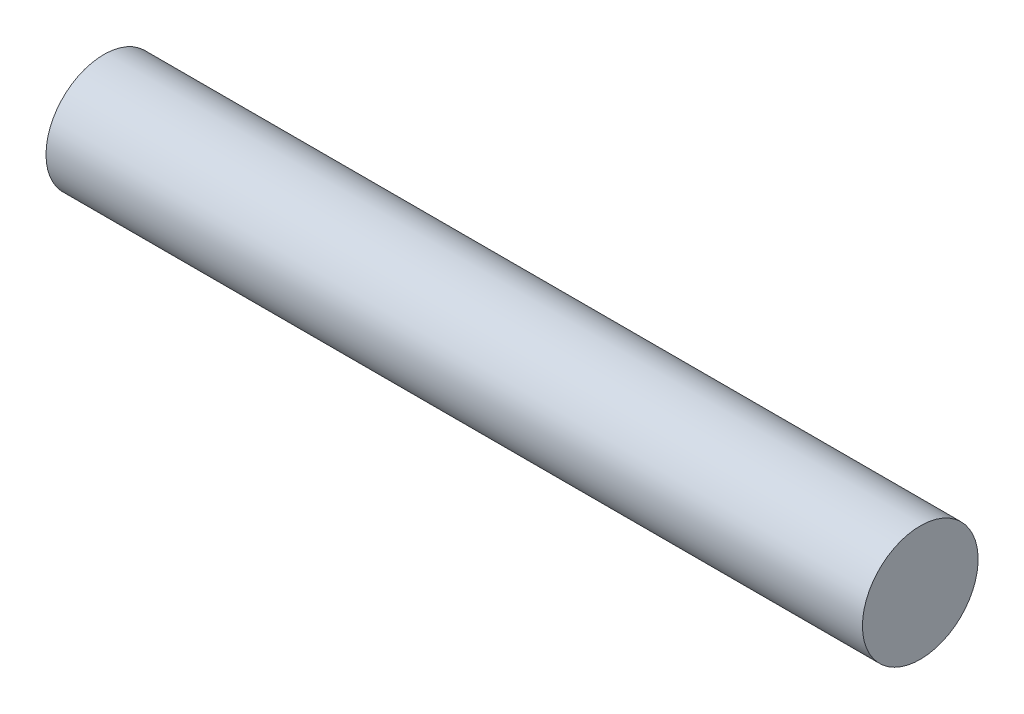
ISO-10303-21;
HEADER;
FILE_DESCRIPTION(('STEP AP214'),'2;1');
FILE_NAME('part.step','',(''),(''),'','','');
FILE_SCHEMA(('AUTOMOTIVE_DESIGN { 1 0 10303 214 1 1 1 1 }'));
ENDSEC;
DATA;
#1=APPLICATION_CONTEXT('core data for automotive mechanical design processes');
#2=APPLICATION_PROTOCOL_DEFINITION('international standard','automotive_design',2000,#1);
#3=PRODUCT_CONTEXT('',#1,'mechanical');
#4=PRODUCT('Part','Part','',(#3));
#5=PRODUCT_RELATED_PRODUCT_CATEGORY('part','',(#4));
#6=PRODUCT_DEFINITION_FORMATION('','',#4);
#7=PRODUCT_DEFINITION_CONTEXT('part definition',#1,'design');
#8=PRODUCT_DEFINITION('design','',#6,#7);
#9=PRODUCT_DEFINITION_SHAPE('','',#8);
#10=(LENGTH_UNIT() NAMED_UNIT(*) SI_UNIT(.MILLI.,.METRE.));
#11=(NAMED_UNIT(*) PLANE_ANGLE_UNIT() SI_UNIT($,.RADIAN.));
#12=(NAMED_UNIT(*) SI_UNIT($,.STERADIAN.) SOLID_ANGLE_UNIT());
#13=UNCERTAINTY_MEASURE_WITH_UNIT(LENGTH_MEASURE(1.E-05),#10,'distance_accuracy_value','');
#14=(GEOMETRIC_REPRESENTATION_CONTEXT(3) GLOBAL_UNCERTAINTY_ASSIGNED_CONTEXT((#13)) GLOBAL_UNIT_ASSIGNED_CONTEXT((#10,
#11,#12)) REPRESENTATION_CONTEXT('',''));
#15=CARTESIAN_POINT('',(0.,0.,0.));
#16=DIRECTION('',(0.,0.,1.));
#17=DIRECTION('',(1.,0.,0.));
#18=AXIS2_PLACEMENT_3D('',#15,#16,#17);
#19=CARTESIAN_POINT('',(0.,0.,-63.7499999999998));
#20=DIRECTION('',(-1.,0.,0.));
#21=DIRECTION('',(0.,0.,1.));
#22=AXIS2_PLACEMENT_3D('',#19,#20,#21);
#23=PLANE('',#22);
#24=CARTESIAN_POINT('',(0.,0.,-63.7499999999998));
#25=DIRECTION('',(-1.,0.,0.));
#26=DIRECTION('',(0.,0.,1.));
#27=AXIS2_PLACEMENT_3D('',#24,#25,#26);
#28=CIRCLE('',#27,63.7499999999998);
#29=CARTESIAN_POINT('',(0.,0.,0.));
#30=VERTEX_POINT('',#29);
#31=EDGE_CURVE('E10',#30,#30,#28,.T.);
#32=ORIENTED_EDGE('',*,*,#31,.T.);
#33=EDGE_LOOP('',(#32));
#34=FACE_BOUND('',#33,.T.);
#35=ADVANCED_FACE('F35',(#34),#23,.T.);
#36=CARTESIAN_POINT('',(900.,0.,-63.7499999999999));
#37=DIRECTION('',(-1.,0.,0.));
#38=DIRECTION('',(0.,0.,1.));
#39=AXIS2_PLACEMENT_3D('',#36,#37,#38);
#40=CYLINDRICAL_SURFACE('',#39,63.7499999999999);
#41=CARTESIAN_POINT('',(900.,0.,-63.7499999999999));
#42=DIRECTION('',(-1.,0.,0.));
#43=DIRECTION('',(0.,0.,1.));
#44=AXIS2_PLACEMENT_3D('',#41,#42,#43);
#45=CIRCLE('',#44,63.7499999999999);
#46=CARTESIAN_POINT('',(900.,0.,0.));
#47=VERTEX_POINT('',#46);
#48=EDGE_CURVE('E41',#47,#47,#45,.T.);
#49=ORIENTED_EDGE('',*,*,#48,.T.);
#50=EDGE_LOOP('',(#49));
#51=FACE_BOUND('',#50,.T.);
#52=ORIENTED_EDGE('',*,*,#31,.F.);
#53=EDGE_LOOP('',(#52));
#54=FACE_BOUND('',#53,.T.);
#55=ADVANCED_FACE('F47',(#51,#54),#40,.T.);
#56=CARTESIAN_POINT('',(900.,0.,0.));
#57=DIRECTION('',(1.,0.,0.));
#58=DIRECTION('',(0.,0.,-1.));
#59=AXIS2_PLACEMENT_3D('',#56,#57,#58);
#60=PLANE('',#59);
#61=ORIENTED_EDGE('',*,*,#48,.F.);
#62=EDGE_LOOP('',(#61));
#63=FACE_BOUND('',#62,.T.);
#64=ADVANCED_FACE('F50',(#63),#60,.T.);
#65=CLOSED_SHELL('',(#35,#55,#64));
#66=MANIFOLD_SOLID_BREP('B2',#65);
#67=ADVANCED_BREP_SHAPE_REPRESENTATION('',(#18,#66),#14);
#68=SHAPE_DEFINITION_REPRESENTATION(#9,#67);
ENDSEC;
END-ISO-10303-21;
